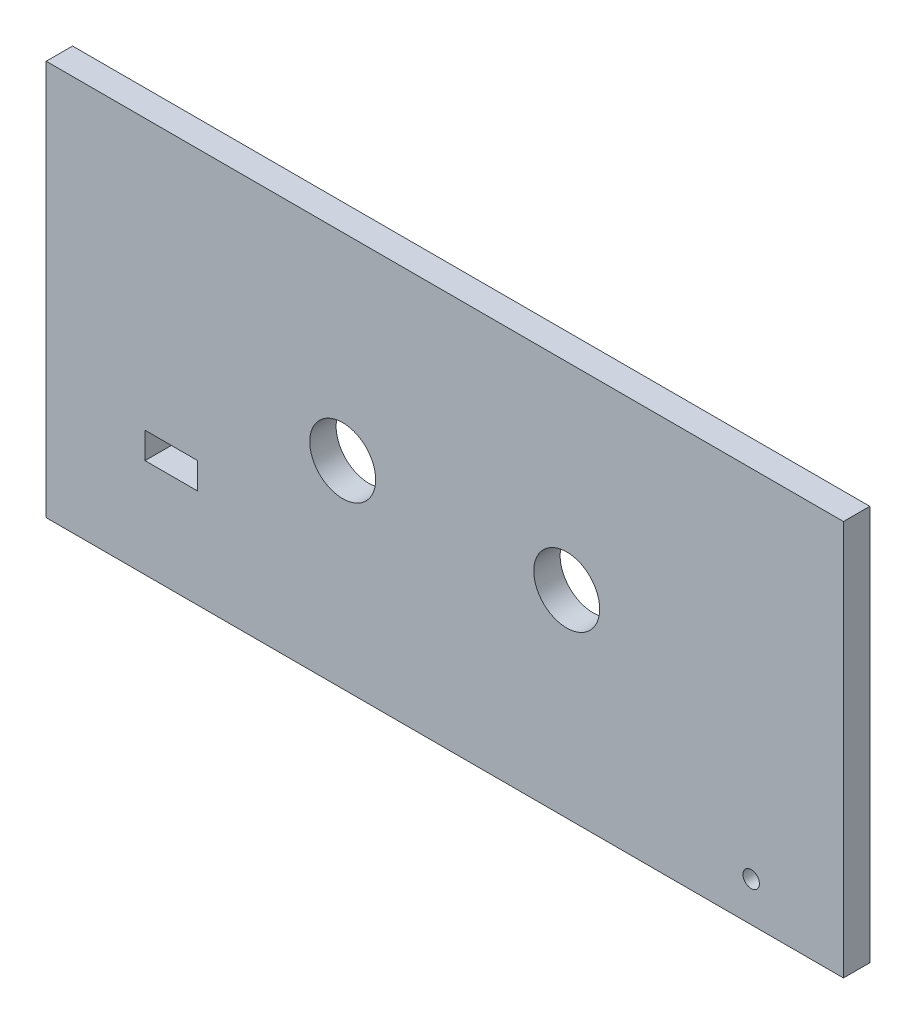
ISO-10303-21;
HEADER;
FILE_DESCRIPTION(('STEP AP214'),'2;1');
FILE_NAME('part.step','',(''),(''),'','','');
FILE_SCHEMA(('AUTOMOTIVE_DESIGN { 1 0 10303 214 1 1 1 1 }'));
ENDSEC;
DATA;
#1=APPLICATION_CONTEXT('core data for automotive mechanical design processes');
#2=APPLICATION_PROTOCOL_DEFINITION('international standard','automotive_design',2000,#1);
#3=PRODUCT_CONTEXT('',#1,'mechanical');
#4=PRODUCT('Part','Part','',(#3));
#5=PRODUCT_RELATED_PRODUCT_CATEGORY('part','',(#4));
#6=PRODUCT_DEFINITION_FORMATION('','',#4);
#7=PRODUCT_DEFINITION_CONTEXT('part definition',#1,'design');
#8=PRODUCT_DEFINITION('design','',#6,#7);
#9=PRODUCT_DEFINITION_SHAPE('','',#8);
#10=(LENGTH_UNIT() NAMED_UNIT(*) SI_UNIT(.MILLI.,.METRE.));
#11=(NAMED_UNIT(*) PLANE_ANGLE_UNIT() SI_UNIT($,.RADIAN.));
#12=(NAMED_UNIT(*) SI_UNIT($,.STERADIAN.) SOLID_ANGLE_UNIT());
#13=UNCERTAINTY_MEASURE_WITH_UNIT(LENGTH_MEASURE(1.E-05),#10,'distance_accuracy_value','');
#14=(GEOMETRIC_REPRESENTATION_CONTEXT(3) GLOBAL_UNCERTAINTY_ASSIGNED_CONTEXT((#13)) GLOBAL_UNIT_ASSIGNED_CONTEXT((#10,
#11,#12)) REPRESENTATION_CONTEXT('',''));
#15=CARTESIAN_POINT('',(0.,0.,0.));
#16=DIRECTION('',(0.,0.,1.));
#17=DIRECTION('',(1.,0.,0.));
#18=AXIS2_PLACEMENT_3D('',#15,#16,#17);
#19=CARTESIAN_POINT('',(0.,0.,4.));
#20=DIRECTION('',(0.,0.,-1.));
#21=DIRECTION('',(-1.,0.,0.));
#22=AXIS2_PLACEMENT_3D('',#19,#20,#21);
#23=PLANE('',#22);
#24=DIRECTION('',(0.,1.,0.));
#25=VECTOR('',#24,1.);
#26=CARTESIAN_POINT('',(42.,-18.3961067517389,4.));
#27=LINE('',#26,#25);
#28=CARTESIAN_POINT('',(42.,-18.3961067517389,4.));
#29=VERTEX_POINT('',#28);
#30=CARTESIAN_POINT('',(42.,41.6038932482611,4.));
#31=VERTEX_POINT('',#30);
#32=EDGE_CURVE('E136',#29,#31,#27,.T.);
#33=ORIENTED_EDGE('',*,*,#32,.T.);
#34=DIRECTION('',(-1.,0.,0.));
#35=VECTOR('',#34,1.);
#36=CARTESIAN_POINT('',(-79.,41.6038932482611,4.));
#37=LINE('',#36,#35);
#38=CARTESIAN_POINT('',(-79.,41.6038932482611,4.));
#39=VERTEX_POINT('',#38);
#40=EDGE_CURVE('E139',#31,#39,#37,.T.);
#41=ORIENTED_EDGE('',*,*,#40,.T.);
#42=DIRECTION('',(0.,-1.,0.));
#43=VECTOR('',#42,1.);
#44=CARTESIAN_POINT('',(-79.,-18.3961067517389,4.));
#45=LINE('',#44,#43);
#46=CARTESIAN_POINT('',(-79.,-18.3961067517389,4.));
#47=VERTEX_POINT('',#46);
#48=EDGE_CURVE('E142',#39,#47,#45,.T.);
#49=ORIENTED_EDGE('',*,*,#48,.T.);
#50=DIRECTION('',(1.,0.,0.));
#51=VECTOR('',#50,1.);
#52=CARTESIAN_POINT('',(-79.,-18.3961067517389,4.));
#53=LINE('',#52,#51);
#54=EDGE_CURVE('E144',#47,#29,#53,.T.);
#55=ORIENTED_EDGE('',*,*,#54,.T.);
#56=EDGE_LOOP('',(#33,#41,#49,#55));
#57=FACE_BOUND('',#56,.T.);
#58=DIRECTION('',(0.,-1.,0.));
#59=VECTOR('',#58,1.);
#60=CARTESIAN_POINT('',(-64.,0.603893248261145,4.));
#61=LINE('',#60,#59);
#62=CARTESIAN_POINT('',(-64.,0.603893248261145,4.));
#63=VERTEX_POINT('',#62);
#64=CARTESIAN_POINT('',(-64.,-3.39610675173885,4.));
#65=VERTEX_POINT('',#64);
#66=EDGE_CURVE('E97',#63,#65,#61,.T.);
#67=ORIENTED_EDGE('',*,*,#66,.F.);
#68=DIRECTION('',(-1.,0.,0.));
#69=VECTOR('',#68,1.);
#70=CARTESIAN_POINT('',(-64.,0.603893248261145,4.));
#71=LINE('',#70,#69);
#72=CARTESIAN_POINT('',(-56.,0.603893248261145,4.));
#73=VERTEX_POINT('',#72);
#74=EDGE_CURVE('E120',#73,#63,#71,.T.);
#75=ORIENTED_EDGE('',*,*,#74,.F.);
#76=DIRECTION('',(0.,1.,0.));
#77=VECTOR('',#76,1.);
#78=CARTESIAN_POINT('',(-56.,0.603893248261145,4.));
#79=LINE('',#78,#77);
#80=CARTESIAN_POINT('',(-56.,-3.39610675173885,4.));
#81=VERTEX_POINT('',#80);
#82=EDGE_CURVE('E118',#81,#73,#79,.T.);
#83=ORIENTED_EDGE('',*,*,#82,.F.);
#84=DIRECTION('',(1.,0.,0.));
#85=VECTOR('',#84,1.);
#86=CARTESIAN_POINT('',(-64.,-3.39610675173885,4.));
#87=LINE('',#86,#85);
#88=EDGE_CURVE('E105',#65,#81,#87,.T.);
#89=ORIENTED_EDGE('',*,*,#88,.F.);
#90=EDGE_LOOP('',(#67,#75,#83,#89));
#91=FACE_BOUND('',#90,.T.);
#92=CARTESIAN_POINT('',(0.,11.6038932482611,4.));
#93=DIRECTION('',(0.,0.,1.));
#94=DIRECTION('',(1.,0.,0.));
#95=AXIS2_PLACEMENT_3D('',#92,#93,#94);
#96=CIRCLE('',#95,5.);
#97=CARTESIAN_POINT('',(5.,11.6038932482611,4.));
#98=VERTEX_POINT('',#97);
#99=EDGE_CURVE('E126',#98,#98,#96,.T.);
#100=ORIENTED_EDGE('',*,*,#99,.F.);
#101=EDGE_LOOP('',(#100));
#102=FACE_BOUND('',#101,.T.);
#103=CARTESIAN_POINT('',(-34.,11.6038932482611,4.));
#104=DIRECTION('',(0.,0.,1.));
#105=DIRECTION('',(1.,0.,0.));
#106=AXIS2_PLACEMENT_3D('',#103,#104,#105);
#107=CIRCLE('',#106,5.);
#108=CARTESIAN_POINT('',(-29.,11.6038932482611,4.));
#109=VERTEX_POINT('',#108);
#110=EDGE_CURVE('E238',#109,#109,#107,.T.);
#111=ORIENTED_EDGE('',*,*,#110,.F.);
#112=EDGE_LOOP('',(#111));
#113=FACE_BOUND('',#112,.T.);
#114=CARTESIAN_POINT('',(28.,-12.3961067517389,4.));
#115=DIRECTION('',(0.,0.,1.));
#116=DIRECTION('',(1.,0.,0.));
#117=AXIS2_PLACEMENT_3D('',#114,#115,#116);
#118=CIRCLE('',#117,1.25);
#119=CARTESIAN_POINT('',(29.25,-12.3961067517389,4.));
#120=VERTEX_POINT('',#119);
#121=EDGE_CURVE('E229',#120,#120,#118,.T.);
#122=ORIENTED_EDGE('',*,*,#121,.F.);
#123=EDGE_LOOP('',(#122));
#124=FACE_BOUND('',#123,.T.);
#125=ADVANCED_FACE('F32',(#57,#91,#102,#113,#124),#23,.F.);
#126=CARTESIAN_POINT('',(0.,0.,0.));
#127=DIRECTION('',(0.,0.,-1.));
#128=DIRECTION('',(-1.,0.,0.));
#129=AXIS2_PLACEMENT_3D('',#126,#127,#128);
#130=PLANE('',#129);
#131=CARTESIAN_POINT('',(-34.,11.6038932482611,0.));
#132=DIRECTION('',(0.,0.,1.));
#133=DIRECTION('',(1.,0.,0.));
#134=AXIS2_PLACEMENT_3D('',#131,#132,#133);
#135=CIRCLE('',#134,5.);
#136=CARTESIAN_POINT('',(-29.,11.6038932482611,0.));
#137=VERTEX_POINT('',#136);
#138=EDGE_CURVE('E235',#137,#137,#135,.T.);
#139=ORIENTED_EDGE('',*,*,#138,.T.);
#140=EDGE_LOOP('',(#139));
#141=FACE_BOUND('',#140,.T.);
#142=DIRECTION('',(-1.,0.,0.));
#143=VECTOR('',#142,1.);
#144=CARTESIAN_POINT('',(-64.,0.603893248261145,0.));
#145=LINE('',#144,#143);
#146=CARTESIAN_POINT('',(-56.,0.603893248261145,0.));
#147=VERTEX_POINT('',#146);
#148=CARTESIAN_POINT('',(-64.,0.603893248261145,0.));
#149=VERTEX_POINT('',#148);
#150=EDGE_CURVE('E106',#147,#149,#145,.T.);
#151=ORIENTED_EDGE('',*,*,#150,.T.);
#152=DIRECTION('',(0.,-1.,0.));
#153=VECTOR('',#152,1.);
#154=CARTESIAN_POINT('',(-64.,0.603893248261145,0.));
#155=LINE('',#154,#153);
#156=CARTESIAN_POINT('',(-64.,-3.39610675173885,0.));
#157=VERTEX_POINT('',#156);
#158=EDGE_CURVE('E55',#149,#157,#155,.T.);
#159=ORIENTED_EDGE('',*,*,#158,.T.);
#160=DIRECTION('',(1.,0.,0.));
#161=VECTOR('',#160,1.);
#162=CARTESIAN_POINT('',(-64.,-3.39610675173885,0.));
#163=LINE('',#162,#161);
#164=CARTESIAN_POINT('',(-56.,-3.39610675173885,0.));
#165=VERTEX_POINT('',#164);
#166=EDGE_CURVE('E112',#157,#165,#163,.T.);
#167=ORIENTED_EDGE('',*,*,#166,.T.);
#168=DIRECTION('',(0.,1.,0.));
#169=VECTOR('',#168,1.);
#170=CARTESIAN_POINT('',(-56.,0.603893248261145,0.));
#171=LINE('',#170,#169);
#172=EDGE_CURVE('E128',#165,#147,#171,.T.);
#173=ORIENTED_EDGE('',*,*,#172,.T.);
#174=EDGE_LOOP('',(#151,#159,#167,#173));
#175=FACE_BOUND('',#174,.T.);
#176=DIRECTION('',(0.,1.,0.));
#177=VECTOR('',#176,1.);
#178=CARTESIAN_POINT('',(42.,-18.3961067517389,0.));
#179=LINE('',#178,#177);
#180=CARTESIAN_POINT('',(42.,-18.3961067517389,0.));
#181=VERTEX_POINT('',#180);
#182=CARTESIAN_POINT('',(42.,41.6038932482611,0.));
#183=VERTEX_POINT('',#182);
#184=EDGE_CURVE('E113',#181,#183,#179,.T.);
#185=ORIENTED_EDGE('',*,*,#184,.F.);
#186=DIRECTION('',(1.,0.,0.));
#187=VECTOR('',#186,1.);
#188=CARTESIAN_POINT('',(-79.,-18.3961067517389,0.));
#189=LINE('',#188,#187);
#190=CARTESIAN_POINT('',(-79.,-18.3961067517389,0.));
#191=VERTEX_POINT('',#190);
#192=EDGE_CURVE('E140',#191,#181,#189,.T.);
#193=ORIENTED_EDGE('',*,*,#192,.F.);
#194=DIRECTION('',(0.,-1.,0.));
#195=VECTOR('',#194,1.);
#196=CARTESIAN_POINT('',(-79.,-18.3961067517389,0.));
#197=LINE('',#196,#195);
#198=CARTESIAN_POINT('',(-79.,41.6038932482611,0.));
#199=VERTEX_POINT('',#198);
#200=EDGE_CURVE('E151',#199,#191,#197,.T.);
#201=ORIENTED_EDGE('',*,*,#200,.F.);
#202=DIRECTION('',(-1.,0.,0.));
#203=VECTOR('',#202,1.);
#204=CARTESIAN_POINT('',(-79.,41.6038932482611,0.));
#205=LINE('',#204,#203);
#206=EDGE_CURVE('E149',#183,#199,#205,.T.);
#207=ORIENTED_EDGE('',*,*,#206,.F.);
#208=EDGE_LOOP('',(#185,#193,#201,#207));
#209=FACE_BOUND('',#208,.T.);
#210=CARTESIAN_POINT('',(0.,11.6038932482611,0.));
#211=DIRECTION('',(0.,0.,1.));
#212=DIRECTION('',(1.,0.,0.));
#213=AXIS2_PLACEMENT_3D('',#210,#211,#212);
#214=CIRCLE('',#213,5.);
#215=CARTESIAN_POINT('',(5.,11.6038932482611,0.));
#216=VERTEX_POINT('',#215);
#217=EDGE_CURVE('E241',#216,#216,#214,.T.);
#218=ORIENTED_EDGE('',*,*,#217,.T.);
#219=EDGE_LOOP('',(#218));
#220=FACE_BOUND('',#219,.T.);
#221=CARTESIAN_POINT('',(28.,-12.3961067517389,0.));
#222=DIRECTION('',(0.,0.,1.));
#223=DIRECTION('',(1.,0.,0.));
#224=AXIS2_PLACEMENT_3D('',#221,#222,#223);
#225=CIRCLE('',#224,1.25);
#226=CARTESIAN_POINT('',(29.25,-12.3961067517389,0.));
#227=VERTEX_POINT('',#226);
#228=EDGE_CURVE('E232',#227,#227,#225,.T.);
#229=ORIENTED_EDGE('',*,*,#228,.T.);
#230=EDGE_LOOP('',(#229));
#231=FACE_BOUND('',#230,.T.);
#232=ADVANCED_FACE('F169',(#141,#175,#209,#220,#231),#130,.T.);
#233=CARTESIAN_POINT('',(42.,-18.3961067517389,4.));
#234=DIRECTION('',(-1.,0.,0.));
#235=DIRECTION('',(0.,0.,1.));
#236=AXIS2_PLACEMENT_3D('',#233,#234,#235);
#237=PLANE('',#236);
#238=ORIENTED_EDGE('',*,*,#184,.T.);
#239=DIRECTION('',(0.,0.,-1.));
#240=VECTOR('',#239,1.);
#241=CARTESIAN_POINT('',(42.,41.6038932482611,4.));
#242=LINE('',#241,#240);
#243=EDGE_CURVE('E11',#31,#183,#242,.T.);
#244=ORIENTED_EDGE('',*,*,#243,.F.);
#245=ORIENTED_EDGE('',*,*,#32,.F.);
#246=DIRECTION('',(0.,0.,-1.));
#247=VECTOR('',#246,1.);
#248=CARTESIAN_POINT('',(42.,-18.3961067517389,4.));
#249=LINE('',#248,#247);
#250=EDGE_CURVE('E146',#29,#181,#249,.T.);
#251=ORIENTED_EDGE('',*,*,#250,.T.);
#252=EDGE_LOOP('',(#238,#244,#245,#251));
#253=FACE_BOUND('',#252,.T.);
#254=ADVANCED_FACE('F34',(#253),#237,.F.);
#255=CARTESIAN_POINT('',(-79.,41.6038932482611,4.));
#256=DIRECTION('',(0.,-1.,0.));
#257=DIRECTION('',(0.,0.,-1.));
#258=AXIS2_PLACEMENT_3D('',#255,#256,#257);
#259=PLANE('',#258);
#260=ORIENTED_EDGE('',*,*,#206,.T.);
#261=DIRECTION('',(0.,0.,-1.));
#262=VECTOR('',#261,1.);
#263=CARTESIAN_POINT('',(-79.,41.6038932482611,4.));
#264=LINE('',#263,#262);
#265=EDGE_CURVE('E40',#39,#199,#264,.T.);
#266=ORIENTED_EDGE('',*,*,#265,.F.);
#267=ORIENTED_EDGE('',*,*,#40,.F.);
#268=ORIENTED_EDGE('',*,*,#243,.T.);
#269=EDGE_LOOP('',(#260,#266,#267,#268));
#270=FACE_BOUND('',#269,.T.);
#271=ADVANCED_FACE('F179',(#270),#259,.F.);
#272=CARTESIAN_POINT('',(-79.,-18.3961067517389,4.));
#273=DIRECTION('',(1.,0.,0.));
#274=DIRECTION('',(0.,0.,-1.));
#275=AXIS2_PLACEMENT_3D('',#272,#273,#274);
#276=PLANE('',#275);
#277=ORIENTED_EDGE('',*,*,#200,.T.);
#278=DIRECTION('',(0.,0.,-1.));
#279=VECTOR('',#278,1.);
#280=CARTESIAN_POINT('',(-79.,-18.3961067517389,4.));
#281=LINE('',#280,#279);
#282=EDGE_CURVE('E156',#47,#191,#281,.T.);
#283=ORIENTED_EDGE('',*,*,#282,.F.);
#284=ORIENTED_EDGE('',*,*,#48,.F.);
#285=ORIENTED_EDGE('',*,*,#265,.T.);
#286=EDGE_LOOP('',(#277,#283,#284,#285));
#287=FACE_BOUND('',#286,.T.);
#288=ADVANCED_FACE('F163',(#287),#276,.F.);
#289=CARTESIAN_POINT('',(-79.,-18.3961067517389,4.));
#290=DIRECTION('',(0.,1.,0.));
#291=DIRECTION('',(0.,0.,1.));
#292=AXIS2_PLACEMENT_3D('',#289,#290,#291);
#293=PLANE('',#292);
#294=ORIENTED_EDGE('',*,*,#192,.T.);
#295=ORIENTED_EDGE('',*,*,#250,.F.);
#296=ORIENTED_EDGE('',*,*,#54,.F.);
#297=ORIENTED_EDGE('',*,*,#282,.T.);
#298=EDGE_LOOP('',(#294,#295,#296,#297));
#299=FACE_BOUND('',#298,.T.);
#300=ADVANCED_FACE('F173',(#299),#293,.F.);
#301=CARTESIAN_POINT('',(-64.,0.603893248261145,4.));
#302=DIRECTION('',(1.,0.,0.));
#303=DIRECTION('',(0.,0.,-1.));
#304=AXIS2_PLACEMENT_3D('',#301,#302,#303);
#305=PLANE('',#304);
#306=ORIENTED_EDGE('',*,*,#158,.F.);
#307=DIRECTION('',(0.,0.,-1.));
#308=VECTOR('',#307,1.);
#309=CARTESIAN_POINT('',(-64.,0.603893248261145,4.));
#310=LINE('',#309,#308);
#311=EDGE_CURVE('E101',#63,#149,#310,.T.);
#312=ORIENTED_EDGE('',*,*,#311,.F.);
#313=ORIENTED_EDGE('',*,*,#66,.T.);
#314=DIRECTION('',(0.,0.,-1.));
#315=VECTOR('',#314,1.);
#316=CARTESIAN_POINT('',(-64.,-3.39610675173885,4.));
#317=LINE('',#316,#315);
#318=EDGE_CURVE('E100',#65,#157,#317,.T.);
#319=ORIENTED_EDGE('',*,*,#318,.T.);
#320=EDGE_LOOP('',(#306,#312,#313,#319));
#321=FACE_BOUND('',#320,.T.);
#322=ADVANCED_FACE('F99',(#321),#305,.T.);
#323=CARTESIAN_POINT('',(-64.,-3.39610675173885,4.));
#324=DIRECTION('',(0.,1.,0.));
#325=DIRECTION('',(0.,0.,1.));
#326=AXIS2_PLACEMENT_3D('',#323,#324,#325);
#327=PLANE('',#326);
#328=ORIENTED_EDGE('',*,*,#166,.F.);
#329=ORIENTED_EDGE('',*,*,#318,.F.);
#330=ORIENTED_EDGE('',*,*,#88,.T.);
#331=DIRECTION('',(0.,0.,-1.));
#332=VECTOR('',#331,1.);
#333=CARTESIAN_POINT('',(-56.,-3.39610675173885,4.));
#334=LINE('',#333,#332);
#335=EDGE_CURVE('E114',#81,#165,#334,.T.);
#336=ORIENTED_EDGE('',*,*,#335,.T.);
#337=EDGE_LOOP('',(#328,#329,#330,#336));
#338=FACE_BOUND('',#337,.T.);
#339=ADVANCED_FACE('F109',(#338),#327,.T.);
#340=CARTESIAN_POINT('',(-56.,0.603893248261145,4.));
#341=DIRECTION('',(-1.,0.,0.));
#342=DIRECTION('',(0.,0.,1.));
#343=AXIS2_PLACEMENT_3D('',#340,#341,#342);
#344=PLANE('',#343);
#345=ORIENTED_EDGE('',*,*,#172,.F.);
#346=ORIENTED_EDGE('',*,*,#335,.F.);
#347=ORIENTED_EDGE('',*,*,#82,.T.);
#348=DIRECTION('',(0.,0.,-1.));
#349=VECTOR('',#348,1.);
#350=CARTESIAN_POINT('',(-56.,0.603893248261145,4.));
#351=LINE('',#350,#349);
#352=EDGE_CURVE('E47',#73,#147,#351,.T.);
#353=ORIENTED_EDGE('',*,*,#352,.T.);
#354=EDGE_LOOP('',(#345,#346,#347,#353));
#355=FACE_BOUND('',#354,.T.);
#356=ADVANCED_FACE('F203',(#355),#344,.T.);
#357=CARTESIAN_POINT('',(-64.,0.603893248261145,4.));
#358=DIRECTION('',(0.,-1.,0.));
#359=DIRECTION('',(0.,0.,-1.));
#360=AXIS2_PLACEMENT_3D('',#357,#358,#359);
#361=PLANE('',#360);
#362=ORIENTED_EDGE('',*,*,#150,.F.);
#363=ORIENTED_EDGE('',*,*,#352,.F.);
#364=ORIENTED_EDGE('',*,*,#74,.T.);
#365=ORIENTED_EDGE('',*,*,#311,.T.);
#366=EDGE_LOOP('',(#362,#363,#364,#365));
#367=FACE_BOUND('',#366,.T.);
#368=ADVANCED_FACE('F207',(#367),#361,.T.);
#369=CARTESIAN_POINT('',(0.,11.6038932482611,4.));
#370=DIRECTION('',(0.,0.,-1.));
#371=DIRECTION('',(-1.,0.,0.));
#372=AXIS2_PLACEMENT_3D('',#369,#370,#371);
#373=CYLINDRICAL_SURFACE('',#372,5.);
#374=ORIENTED_EDGE('',*,*,#99,.T.);
#375=EDGE_LOOP('',(#374));
#376=FACE_BOUND('',#375,.T.);
#377=ORIENTED_EDGE('',*,*,#217,.F.);
#378=EDGE_LOOP('',(#377));
#379=FACE_BOUND('',#378,.T.);
#380=ADVANCED_FACE('F213',(#376,#379),#373,.F.);
#381=CARTESIAN_POINT('',(-34.,11.6038932482611,4.));
#382=DIRECTION('',(0.,0.,-1.));
#383=DIRECTION('',(-1.,0.,0.));
#384=AXIS2_PLACEMENT_3D('',#381,#382,#383);
#385=CYLINDRICAL_SURFACE('',#384,5.);
#386=ORIENTED_EDGE('',*,*,#110,.T.);
#387=EDGE_LOOP('',(#386));
#388=FACE_BOUND('',#387,.T.);
#389=ORIENTED_EDGE('',*,*,#138,.F.);
#390=EDGE_LOOP('',(#389));
#391=FACE_BOUND('',#390,.T.);
#392=ADVANCED_FACE('F216',(#388,#391),#385,.F.);
#393=CARTESIAN_POINT('',(28.,-12.3961067517389,4.));
#394=DIRECTION('',(0.,0.,-1.));
#395=DIRECTION('',(-1.,0.,0.));
#396=AXIS2_PLACEMENT_3D('',#393,#394,#395);
#397=CYLINDRICAL_SURFACE('',#396,1.25);
#398=ORIENTED_EDGE('',*,*,#121,.T.);
#399=EDGE_LOOP('',(#398));
#400=FACE_BOUND('',#399,.T.);
#401=ORIENTED_EDGE('',*,*,#228,.F.);
#402=EDGE_LOOP('',(#401));
#403=FACE_BOUND('',#402,.T.);
#404=ADVANCED_FACE('F220',(#400,#403),#397,.F.);
#405=CLOSED_SHELL('',(#125,#232,#254,#271,#288,#300,#322,#339,#356,#368,#380,#392,#404));
#406=MANIFOLD_SOLID_BREP('B2',#405);
#407=ADVANCED_BREP_SHAPE_REPRESENTATION('',(#18,#406),#14);
#408=SHAPE_DEFINITION_REPRESENTATION(#9,#407);
ENDSEC;
END-ISO-10303-21;
